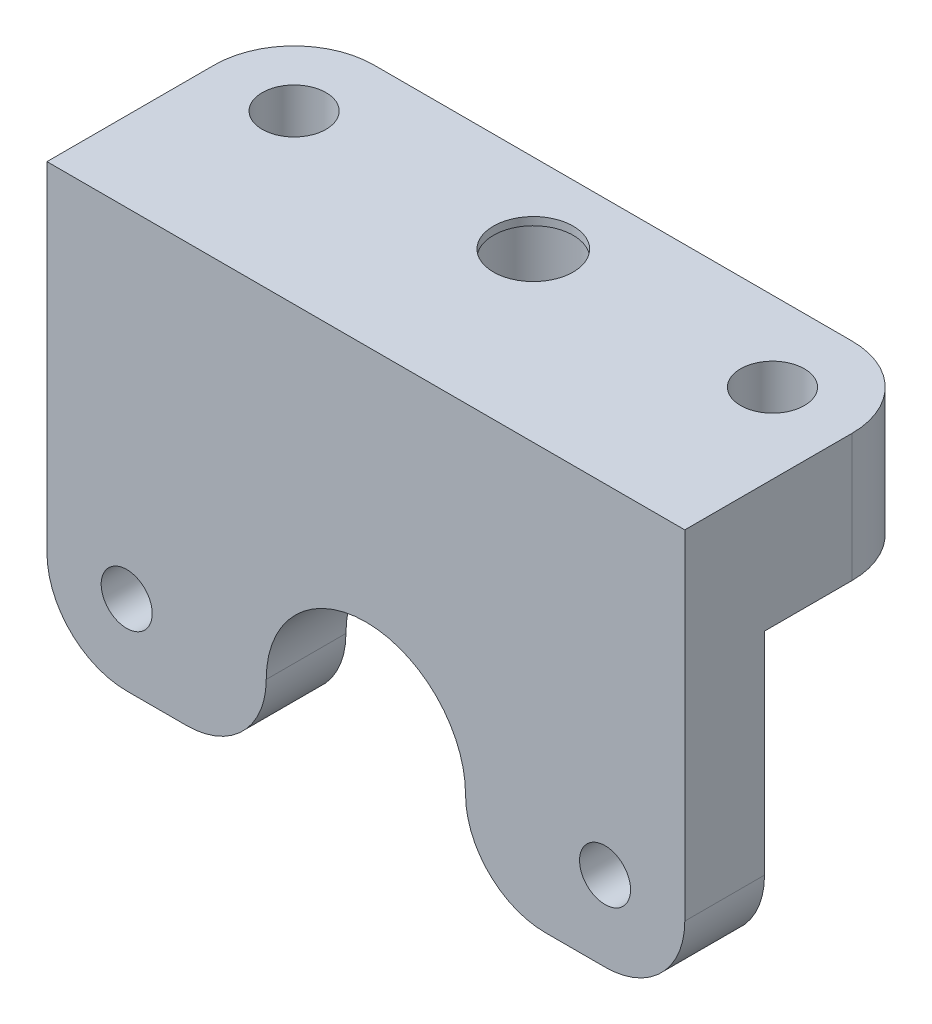
ISO-10303-21;
HEADER;
FILE_DESCRIPTION(('STEP AP214'),'2;1');
FILE_NAME('part.step','',(''),(''),'','','');
FILE_SCHEMA(('AUTOMOTIVE_DESIGN { 1 0 10303 214 1 1 1 1 }'));
ENDSEC;
DATA;
#1=APPLICATION_CONTEXT('core data for automotive mechanical design processes');
#2=APPLICATION_PROTOCOL_DEFINITION('international standard','automotive_design',2000,#1);
#3=PRODUCT_CONTEXT('',#1,'mechanical');
#4=PRODUCT('Part','Part','',(#3));
#5=PRODUCT_RELATED_PRODUCT_CATEGORY('part','',(#4));
#6=PRODUCT_DEFINITION_FORMATION('','',#4);
#7=PRODUCT_DEFINITION_CONTEXT('part definition',#1,'design');
#8=PRODUCT_DEFINITION('design','',#6,#7);
#9=PRODUCT_DEFINITION_SHAPE('','',#8);
#10=(LENGTH_UNIT() NAMED_UNIT(*) SI_UNIT(.MILLI.,.METRE.));
#11=(NAMED_UNIT(*) PLANE_ANGLE_UNIT() SI_UNIT($,.RADIAN.));
#12=(NAMED_UNIT(*) SI_UNIT($,.STERADIAN.) SOLID_ANGLE_UNIT());
#13=UNCERTAINTY_MEASURE_WITH_UNIT(LENGTH_MEASURE(1.E-05),#10,'distance_accuracy_value','');
#14=(GEOMETRIC_REPRESENTATION_CONTEXT(3) GLOBAL_UNCERTAINTY_ASSIGNED_CONTEXT((#13)) GLOBAL_UNIT_ASSIGNED_CONTEXT((#10,
#11,#12)) REPRESENTATION_CONTEXT('',''));
#15=CARTESIAN_POINT('',(0.,0.,0.));
#16=DIRECTION('',(0.,0.,1.));
#17=DIRECTION('',(1.,0.,0.));
#18=AXIS2_PLACEMENT_3D('',#15,#16,#17);
#19=CARTESIAN_POINT('',(15.,6.,0.));
#20=DIRECTION('',(0.,1.,0.));
#21=DIRECTION('',(0.,0.,1.));
#22=AXIS2_PLACEMENT_3D('',#19,#20,#21);
#23=PLANE('',#22);
#24=CARTESIAN_POINT('',(15.,6.,0.));
#25=DIRECTION('',(0.,1.,0.));
#26=DIRECTION('',(0.,0.,1.));
#27=AXIS2_PLACEMENT_3D('',#24,#25,#26);
#28=CIRCLE('',#27,1.2645);
#29=CARTESIAN_POINT('',(15.,6.,1.2645));
#30=VERTEX_POINT('',#29);
#31=EDGE_CURVE('E17',#30,#30,#28,.F.);
#32=ORIENTED_EDGE('',*,*,#31,.T.);
#33=EDGE_LOOP('',(#32));
#34=FACE_BOUND('',#33,.T.);
#35=CARTESIAN_POINT('',(15.,6.,0.));
#36=DIRECTION('',(0.,1.,0.));
#37=DIRECTION('',(0.,0.,1.));
#38=AXIS2_PLACEMENT_3D('',#35,#36,#37);
#39=CIRCLE('',#38,2.);
#40=CARTESIAN_POINT('',(15.,6.,2.));
#41=VERTEX_POINT('',#40);
#42=EDGE_CURVE('E143',#41,#41,#39,.T.);
#43=ORIENTED_EDGE('',*,*,#42,.T.);
#44=EDGE_LOOP('',(#43));
#45=FACE_BOUND('',#44,.T.);
#46=ADVANCED_FACE('F14',(#34,#45),#23,.T.);
#47=CARTESIAN_POINT('',(-15.,6.,0.));
#48=DIRECTION('',(0.,1.,0.));
#49=DIRECTION('',(0.,0.,1.));
#50=AXIS2_PLACEMENT_3D('',#47,#48,#49);
#51=PLANE('',#50);
#52=CARTESIAN_POINT('',(-15.,6.,0.));
#53=DIRECTION('',(0.,1.,0.));
#54=DIRECTION('',(0.,0.,1.));
#55=AXIS2_PLACEMENT_3D('',#52,#53,#54);
#56=CIRCLE('',#55,1.2645);
#57=CARTESIAN_POINT('',(-15.,6.,1.2645));
#58=VERTEX_POINT('',#57);
#59=EDGE_CURVE('E148',#58,#58,#56,.F.);
#60=ORIENTED_EDGE('',*,*,#59,.T.);
#61=EDGE_LOOP('',(#60));
#62=FACE_BOUND('',#61,.T.);
#63=CARTESIAN_POINT('',(-15.,6.,0.));
#64=DIRECTION('',(0.,1.,0.));
#65=DIRECTION('',(0.,0.,1.));
#66=AXIS2_PLACEMENT_3D('',#63,#64,#65);
#67=CIRCLE('',#66,2.);
#68=CARTESIAN_POINT('',(-15.,6.,2.));
#69=VERTEX_POINT('',#68);
#70=EDGE_CURVE('E140',#69,#69,#67,.T.);
#71=ORIENTED_EDGE('',*,*,#70,.T.);
#72=EDGE_LOOP('',(#71));
#73=FACE_BOUND('',#72,.T.);
#74=ADVANCED_FACE('F171',(#62,#73),#51,.T.);
#75=CARTESIAN_POINT('',(0.,9.5,0.));
#76=DIRECTION('',(0.,1.,0.));
#77=DIRECTION('',(0.,0.,1.));
#78=AXIS2_PLACEMENT_3D('',#75,#76,#77);
#79=PLANE('',#78);
#80=CARTESIAN_POINT('',(0.,9.5,0.));
#81=DIRECTION('',(0.,1.,0.));
#82=DIRECTION('',(0.,0.,1.));
#83=AXIS2_PLACEMENT_3D('',#80,#81,#82);
#84=CIRCLE('',#83,2.5);
#85=CARTESIAN_POINT('',(0.,9.5,2.5));
#86=VERTEX_POINT('',#85);
#87=EDGE_CURVE('E124',#86,#86,#84,.T.);
#88=ORIENTED_EDGE('',*,*,#87,.T.);
#89=EDGE_LOOP('',(#88));
#90=FACE_BOUND('',#89,.T.);
#91=CARTESIAN_POINT('',(0.,9.5,0.));
#92=DIRECTION('',(0.,1.,0.));
#93=DIRECTION('',(0.,0.,1.));
#94=AXIS2_PLACEMENT_3D('',#91,#92,#93);
#95=CIRCLE('',#94,3.125);
#96=CARTESIAN_POINT('',(0.,9.5,3.125));
#97=VERTEX_POINT('',#96);
#98=EDGE_CURVE('E146',#97,#97,#95,.F.);
#99=ORIENTED_EDGE('',*,*,#98,.T.);
#100=EDGE_LOOP('',(#99));
#101=FACE_BOUND('',#100,.T.);
#102=ADVANCED_FACE('F160',(#90,#101),#79,.F.);
#103=CARTESIAN_POINT('',(15.,2.,0.));
#104=DIRECTION('',(0.,1.,0.));
#105=DIRECTION('',(0.,0.,1.));
#106=AXIS2_PLACEMENT_3D('',#103,#104,#105);
#107=CYLINDRICAL_SURFACE('',#106,1.2645);
#108=CARTESIAN_POINT('',(15.,2.,0.));
#109=DIRECTION('',(0.,1.,0.));
#110=DIRECTION('',(0.,0.,1.));
#111=AXIS2_PLACEMENT_3D('',#108,#109,#110);
#112=CIRCLE('',#111,1.2645);
#113=CARTESIAN_POINT('',(15.,2.,1.2645));
#114=VERTEX_POINT('',#113);
#115=EDGE_CURVE('E134',#114,#114,#112,.F.);
#116=ORIENTED_EDGE('',*,*,#115,.T.);
#117=EDGE_LOOP('',(#116));
#118=FACE_BOUND('',#117,.T.);
#119=ORIENTED_EDGE('',*,*,#31,.F.);
#120=EDGE_LOOP('',(#119));
#121=FACE_BOUND('',#120,.T.);
#122=ADVANCED_FACE('F157',(#118,#121),#107,.F.);
#123=CARTESIAN_POINT('',(-15.,2.,0.));
#124=DIRECTION('',(0.,1.,0.));
#125=DIRECTION('',(0.,0.,1.));
#126=AXIS2_PLACEMENT_3D('',#123,#124,#125);
#127=CYLINDRICAL_SURFACE('',#126,1.2645);
#128=CARTESIAN_POINT('',(-15.,2.,0.));
#129=DIRECTION('',(0.,1.,0.));
#130=DIRECTION('',(0.,0.,1.));
#131=AXIS2_PLACEMENT_3D('',#128,#129,#130);
#132=CIRCLE('',#131,1.2645);
#133=CARTESIAN_POINT('',(-15.,2.,1.2645));
#134=VERTEX_POINT('',#133);
#135=EDGE_CURVE('E267',#134,#134,#132,.F.);
#136=ORIENTED_EDGE('',*,*,#135,.T.);
#137=EDGE_LOOP('',(#136));
#138=FACE_BOUND('',#137,.T.);
#139=ORIENTED_EDGE('',*,*,#59,.F.);
#140=EDGE_LOOP('',(#139));
#141=FACE_BOUND('',#140,.T.);
#142=ADVANCED_FACE('F159',(#138,#141),#127,.F.);
#143=CARTESIAN_POINT('',(0.,0.,0.));
#144=DIRECTION('',(0.,1.,0.));
#145=DIRECTION('',(0.,0.,1.));
#146=AXIS2_PLACEMENT_3D('',#143,#144,#145);
#147=CYLINDRICAL_SURFACE('',#146,3.125);
#148=ORIENTED_EDGE('',*,*,#98,.F.);
#149=EDGE_LOOP('',(#148));
#150=FACE_BOUND('',#149,.T.);
#151=CARTESIAN_POINT('',(0.,2.,0.));
#152=DIRECTION('',(0.,1.,0.));
#153=DIRECTION('',(0.,0.,1.));
#154=AXIS2_PLACEMENT_3D('',#151,#152,#153);
#155=CIRCLE('',#154,3.125);
#156=CARTESIAN_POINT('',(0.,2.,3.125));
#157=VERTEX_POINT('',#156);
#158=EDGE_CURVE('E265',#157,#157,#155,.F.);
#159=ORIENTED_EDGE('',*,*,#158,.T.);
#160=EDGE_LOOP('',(#159));
#161=FACE_BOUND('',#160,.T.);
#162=ADVANCED_FACE('F168',(#150,#161),#147,.F.);
#163=CARTESIAN_POINT('',(15.,0.,0.));
#164=DIRECTION('',(0.,1.,0.));
#165=DIRECTION('',(0.,0.,1.));
#166=AXIS2_PLACEMENT_3D('',#163,#164,#165);
#167=CYLINDRICAL_SURFACE('',#166,5.);
#168=CARTESIAN_POINT('',(15.,10.,0.));
#169=DIRECTION('',(0.,1.,0.));
#170=DIRECTION('',(0.,0.,1.));
#171=AXIS2_PLACEMENT_3D('',#168,#169,#170);
#172=CIRCLE('',#171,5.);
#173=CARTESIAN_POINT('',(20.,10.,0.));
#174=VERTEX_POINT('',#173);
#175=CARTESIAN_POINT('',(15.,10.,-5.));
#176=VERTEX_POINT('',#175);
#177=EDGE_CURVE('E278',#174,#176,#172,.T.);
#178=ORIENTED_EDGE('',*,*,#177,.F.);
#179=DIRECTION('',(0.,1.,0.));
#180=VECTOR('',#179,1.);
#181=CARTESIAN_POINT('',(20.,0.,0.));
#182=LINE('',#181,#180);
#183=CARTESIAN_POINT('',(20.,2.,0.));
#184=VERTEX_POINT('',#183);
#185=EDGE_CURVE('E282',#184,#174,#182,.T.);
#186=ORIENTED_EDGE('',*,*,#185,.F.);
#187=CARTESIAN_POINT('',(15.,2.,0.));
#188=DIRECTION('',(0.,1.,0.));
#189=DIRECTION('',(0.,0.,1.));
#190=AXIS2_PLACEMENT_3D('',#187,#188,#189);
#191=CIRCLE('',#190,5.);
#192=CARTESIAN_POINT('',(15.,2.,-5.));
#193=VERTEX_POINT('',#192);
#194=EDGE_CURVE('E132',#184,#193,#191,.T.);
#195=ORIENTED_EDGE('',*,*,#194,.T.);
#196=DIRECTION('',(0.,1.,0.));
#197=VECTOR('',#196,1.);
#198=CARTESIAN_POINT('',(15.,0.,-5.));
#199=LINE('',#198,#197);
#200=EDGE_CURVE('E111',#176,#193,#199,.F.);
#201=ORIENTED_EDGE('',*,*,#200,.F.);
#202=EDGE_LOOP('',(#178,#186,#195,#201));
#203=FACE_BOUND('',#202,.T.);
#204=ADVANCED_FACE('F253',(#203),#167,.T.);
#205=CARTESIAN_POINT('',(15.,0.,-5.));
#206=DIRECTION('',(0.,0.,-1.));
#207=DIRECTION('',(-1.,0.,0.));
#208=AXIS2_PLACEMENT_3D('',#205,#206,#207);
#209=PLANE('',#208);
#210=DIRECTION('',(1.,0.,0.));
#211=VECTOR('',#210,1.);
#212=CARTESIAN_POINT('',(0.,10.,-5.));
#213=LINE('',#212,#211);
#214=CARTESIAN_POINT('',(-15.,10.,-5.));
#215=VERTEX_POINT('',#214);
#216=EDGE_CURVE('E281',#176,#215,#213,.F.);
#217=ORIENTED_EDGE('',*,*,#216,.F.);
#218=ORIENTED_EDGE('',*,*,#200,.T.);
#219=DIRECTION('',(1.,0.,0.));
#220=VECTOR('',#219,1.);
#221=CARTESIAN_POINT('',(0.,2.,-5.));
#222=LINE('',#221,#220);
#223=CARTESIAN_POINT('',(-15.,2.,-5.));
#224=VERTEX_POINT('',#223);
#225=EDGE_CURVE('E105',#193,#224,#222,.F.);
#226=ORIENTED_EDGE('',*,*,#225,.T.);
#227=DIRECTION('',(0.,1.,0.));
#228=VECTOR('',#227,1.);
#229=CARTESIAN_POINT('',(-15.,0.,-5.));
#230=LINE('',#229,#228);
#231=EDGE_CURVE('E109',#215,#224,#230,.F.);
#232=ORIENTED_EDGE('',*,*,#231,.F.);
#233=EDGE_LOOP('',(#217,#218,#226,#232));
#234=FACE_BOUND('',#233,.T.);
#235=ADVANCED_FACE('F108',(#234),#209,.T.);
#236=CARTESIAN_POINT('',(15.,0.,0.));
#237=DIRECTION('',(0.,1.,0.));
#238=DIRECTION('',(0.,0.,1.));
#239=AXIS2_PLACEMENT_3D('',#236,#237,#238);
#240=CYLINDRICAL_SURFACE('',#239,2.);
#241=ORIENTED_EDGE('',*,*,#42,.F.);
#242=EDGE_LOOP('',(#241));
#243=FACE_BOUND('',#242,.T.);
#244=CARTESIAN_POINT('',(15.,10.,0.));
#245=DIRECTION('',(0.,1.,0.));
#246=DIRECTION('',(0.,0.,1.));
#247=AXIS2_PLACEMENT_3D('',#244,#245,#246);
#248=CIRCLE('',#247,2.);
#249=CARTESIAN_POINT('',(15.,10.,2.));
#250=VERTEX_POINT('',#249);
#251=EDGE_CURVE('E285',#250,#250,#248,.F.);
#252=ORIENTED_EDGE('',*,*,#251,.F.);
#253=EDGE_LOOP('',(#252));
#254=FACE_BOUND('',#253,.T.);
#255=ADVANCED_FACE('F246',(#243,#254),#240,.F.);
#256=CARTESIAN_POINT('',(-15.,0.,0.));
#257=DIRECTION('',(0.,1.,0.));
#258=DIRECTION('',(0.,0.,1.));
#259=AXIS2_PLACEMENT_3D('',#256,#257,#258);
#260=CYLINDRICAL_SURFACE('',#259,2.);
#261=ORIENTED_EDGE('',*,*,#70,.F.);
#262=EDGE_LOOP('',(#261));
#263=FACE_BOUND('',#262,.T.);
#264=CARTESIAN_POINT('',(-15.,10.,0.));
#265=DIRECTION('',(0.,1.,0.));
#266=DIRECTION('',(0.,0.,1.));
#267=AXIS2_PLACEMENT_3D('',#264,#265,#266);
#268=CIRCLE('',#267,2.);
#269=CARTESIAN_POINT('',(-15.,10.,2.));
#270=VERTEX_POINT('',#269);
#271=EDGE_CURVE('E288',#270,#270,#268,.F.);
#272=ORIENTED_EDGE('',*,*,#271,.F.);
#273=EDGE_LOOP('',(#272));
#274=FACE_BOUND('',#273,.T.);
#275=ADVANCED_FACE('F242',(#263,#274),#260,.F.);
#276=CARTESIAN_POINT('',(0.,0.,0.));
#277=DIRECTION('',(0.,1.,0.));
#278=DIRECTION('',(0.,0.,1.));
#279=AXIS2_PLACEMENT_3D('',#276,#277,#278);
#280=CYLINDRICAL_SURFACE('',#279,2.5);
#281=ORIENTED_EDGE('',*,*,#87,.F.);
#282=EDGE_LOOP('',(#281));
#283=FACE_BOUND('',#282,.T.);
#284=CARTESIAN_POINT('',(0.,10.,0.));
#285=DIRECTION('',(0.,1.,0.));
#286=DIRECTION('',(0.,0.,1.));
#287=AXIS2_PLACEMENT_3D('',#284,#285,#286);
#288=CIRCLE('',#287,2.5);
#289=CARTESIAN_POINT('',(0.,10.,2.5));
#290=VERTEX_POINT('',#289);
#291=EDGE_CURVE('E291',#290,#290,#288,.F.);
#292=ORIENTED_EDGE('',*,*,#291,.F.);
#293=EDGE_LOOP('',(#292));
#294=FACE_BOUND('',#293,.T.);
#295=ADVANCED_FACE('F239',(#283,#294),#280,.F.);
#296=CARTESIAN_POINT('',(-15.,0.,0.));
#297=DIRECTION('',(0.,1.,0.));
#298=DIRECTION('',(0.,0.,1.));
#299=AXIS2_PLACEMENT_3D('',#296,#297,#298);
#300=CYLINDRICAL_SURFACE('',#299,5.);
#301=CARTESIAN_POINT('',(-15.,10.,0.));
#302=DIRECTION('',(0.,1.,0.));
#303=DIRECTION('',(0.,0.,1.));
#304=AXIS2_PLACEMENT_3D('',#301,#302,#303);
#305=CIRCLE('',#304,5.);
#306=CARTESIAN_POINT('',(-20.,10.,0.));
#307=VERTEX_POINT('',#306);
#308=EDGE_CURVE('E122',#215,#307,#305,.T.);
#309=ORIENTED_EDGE('',*,*,#308,.F.);
#310=ORIENTED_EDGE('',*,*,#231,.T.);
#311=CARTESIAN_POINT('',(-15.,2.,0.));
#312=DIRECTION('',(0.,1.,0.));
#313=DIRECTION('',(0.,0.,1.));
#314=AXIS2_PLACEMENT_3D('',#311,#312,#313);
#315=CIRCLE('',#314,5.);
#316=CARTESIAN_POINT('',(-20.,2.,0.));
#317=VERTEX_POINT('',#316);
#318=EDGE_CURVE('E115',#224,#317,#315,.T.);
#319=ORIENTED_EDGE('',*,*,#318,.T.);
#320=DIRECTION('',(0.,1.,0.));
#321=VECTOR('',#320,1.);
#322=CARTESIAN_POINT('',(-20.,0.,0.));
#323=LINE('',#322,#321);
#324=EDGE_CURVE('E351',#307,#317,#323,.F.);
#325=ORIENTED_EDGE('',*,*,#324,.F.);
#326=EDGE_LOOP('',(#309,#310,#319,#325));
#327=FACE_BOUND('',#326,.T.);
#328=ADVANCED_FACE('F119',(#327),#300,.T.);
#329=CARTESIAN_POINT('',(0.,2.,0.25));
#330=DIRECTION('',(0.,1.,0.));
#331=DIRECTION('',(0.,0.,1.));
#332=AXIS2_PLACEMENT_3D('',#329,#330,#331);
#333=PLANE('',#332);
#334=ORIENTED_EDGE('',*,*,#158,.F.);
#335=EDGE_LOOP('',(#334));
#336=FACE_BOUND('',#335,.T.);
#337=ORIENTED_EDGE('',*,*,#135,.F.);
#338=EDGE_LOOP('',(#337));
#339=FACE_BOUND('',#338,.T.);
#340=ORIENTED_EDGE('',*,*,#115,.F.);
#341=EDGE_LOOP('',(#340));
#342=FACE_BOUND('',#341,.T.);
#343=DIRECTION('',(0.,0.,-1.));
#344=VECTOR('',#343,1.);
#345=CARTESIAN_POINT('',(20.,2.,5.5));
#346=LINE('',#345,#344);
#347=CARTESIAN_POINT('',(20.,2.,5.5));
#348=VERTEX_POINT('',#347);
#349=EDGE_CURVE('E343',#348,#184,#346,.T.);
#350=ORIENTED_EDGE('',*,*,#349,.F.);
#351=DIRECTION('',(1.,0.,0.));
#352=VECTOR('',#351,1.);
#353=CARTESIAN_POINT('',(0.,2.,5.5));
#354=LINE('',#353,#352);
#355=CARTESIAN_POINT('',(-20.,2.,5.5));
#356=VERTEX_POINT('',#355);
#357=EDGE_CURVE('E266',#348,#356,#354,.F.);
#358=ORIENTED_EDGE('',*,*,#357,.T.);
#359=DIRECTION('',(0.,0.,1.));
#360=VECTOR('',#359,1.);
#361=CARTESIAN_POINT('',(-20.,2.,0.));
#362=LINE('',#361,#360);
#363=EDGE_CURVE('E130',#317,#356,#362,.T.);
#364=ORIENTED_EDGE('',*,*,#363,.F.);
#365=ORIENTED_EDGE('',*,*,#318,.F.);
#366=ORIENTED_EDGE('',*,*,#225,.F.);
#367=ORIENTED_EDGE('',*,*,#194,.F.);
#368=EDGE_LOOP('',(#350,#358,#364,#365,#366,#367));
#369=FACE_BOUND('',#368,.T.);
#370=ADVANCED_FACE('F127',(#336,#339,#342,#369),#333,.F.);
#371=CARTESIAN_POINT('',(0.,-3.125,5.5));
#372=DIRECTION('',(0.,0.,1.));
#373=DIRECTION('',(1.,0.,0.));
#374=AXIS2_PLACEMENT_3D('',#371,#372,#373);
#375=PLANE('',#374);
#376=CARTESIAN_POINT('',(15.,-11.25,5.5));
#377=DIRECTION('',(0.,0.,1.));
#378=DIRECTION('',(1.,0.,0.));
#379=AXIS2_PLACEMENT_3D('',#376,#377,#378);
#380=CIRCLE('',#379,1.6);
#381=CARTESIAN_POINT('',(16.6,-11.25,5.5));
#382=VERTEX_POINT('',#381);
#383=EDGE_CURVE('E313',#382,#382,#380,.T.);
#384=ORIENTED_EDGE('',*,*,#383,.T.);
#385=EDGE_LOOP('',(#384));
#386=FACE_BOUND('',#385,.T.);
#387=CARTESIAN_POINT('',(-15.,-11.25,5.5));
#388=DIRECTION('',(0.,0.,1.));
#389=DIRECTION('',(1.,0.,0.));
#390=AXIS2_PLACEMENT_3D('',#387,#388,#389);
#391=CIRCLE('',#390,1.6);
#392=CARTESIAN_POINT('',(-13.4,-11.25,5.5));
#393=VERTEX_POINT('',#392);
#394=EDGE_CURVE('E310',#393,#393,#391,.T.);
#395=ORIENTED_EDGE('',*,*,#394,.T.);
#396=EDGE_LOOP('',(#395));
#397=FACE_BOUND('',#396,.T.);
#398=DIRECTION('',(1.,0.,0.));
#399=VECTOR('',#398,1.);
#400=CARTESIAN_POINT('',(6.25,-16.25,5.5));
#401=LINE('',#400,#399);
#402=CARTESIAN_POINT('',(11.25,-16.25,5.5));
#403=VERTEX_POINT('',#402);
#404=CARTESIAN_POINT('',(15.,-16.25,5.5));
#405=VERTEX_POINT('',#404);
#406=EDGE_CURVE('E314',#403,#405,#401,.T.);
#407=ORIENTED_EDGE('',*,*,#406,.F.);
#408=CARTESIAN_POINT('',(11.25,-11.25,5.5));
#409=DIRECTION('',(0.,0.,1.));
#410=DIRECTION('',(1.,0.,0.));
#411=AXIS2_PLACEMENT_3D('',#408,#409,#410);
#412=CIRCLE('',#411,5.);
#413=CARTESIAN_POINT('',(6.25,-11.25,5.5));
#414=VERTEX_POINT('',#413);
#415=EDGE_CURVE('E307',#414,#403,#412,.T.);
#416=ORIENTED_EDGE('',*,*,#415,.F.);
#417=CARTESIAN_POINT('',(0.,-11.25,5.5));
#418=DIRECTION('',(0.,0.,1.));
#419=DIRECTION('',(1.,0.,0.));
#420=AXIS2_PLACEMENT_3D('',#417,#418,#419);
#421=CIRCLE('',#420,6.25);
#422=CARTESIAN_POINT('',(-6.25,-11.25,5.5));
#423=VERTEX_POINT('',#422);
#424=EDGE_CURVE('E303',#414,#423,#421,.T.);
#425=ORIENTED_EDGE('',*,*,#424,.T.);
#426=CARTESIAN_POINT('',(-11.25,-11.25,5.5));
#427=DIRECTION('',(0.,0.,1.));
#428=DIRECTION('',(1.,0.,0.));
#429=AXIS2_PLACEMENT_3D('',#426,#427,#428);
#430=CIRCLE('',#429,5.);
#431=CARTESIAN_POINT('',(-11.25,-16.25,5.5));
#432=VERTEX_POINT('',#431);
#433=EDGE_CURVE('E299',#432,#423,#430,.T.);
#434=ORIENTED_EDGE('',*,*,#433,.F.);
#435=DIRECTION('',(1.,0.,0.));
#436=VECTOR('',#435,1.);
#437=CARTESIAN_POINT('',(-20.,-16.25,5.5));
#438=LINE('',#437,#436);
#439=CARTESIAN_POINT('',(-15.,-16.25,5.5));
#440=VERTEX_POINT('',#439);
#441=EDGE_CURVE('E362',#440,#432,#438,.T.);
#442=ORIENTED_EDGE('',*,*,#441,.F.);
#443=CARTESIAN_POINT('',(-15.,-11.25,5.5));
#444=DIRECTION('',(0.,0.,1.));
#445=DIRECTION('',(1.,0.,0.));
#446=AXIS2_PLACEMENT_3D('',#443,#444,#445);
#447=CIRCLE('',#446,5.);
#448=CARTESIAN_POINT('',(-20.,-11.25,5.5));
#449=VERTEX_POINT('',#448);
#450=EDGE_CURVE('E295',#449,#440,#447,.T.);
#451=ORIENTED_EDGE('',*,*,#450,.F.);
#452=DIRECTION('',(0.,1.,0.));
#453=VECTOR('',#452,1.);
#454=CARTESIAN_POINT('',(-20.,0.,5.5));
#455=LINE('',#454,#453);
#456=EDGE_CURVE('E356',#356,#449,#455,.F.);
#457=ORIENTED_EDGE('',*,*,#456,.F.);
#458=ORIENTED_EDGE('',*,*,#357,.F.);
#459=DIRECTION('',(0.,1.,0.));
#460=VECTOR('',#459,1.);
#461=CARTESIAN_POINT('',(20.,0.,5.5));
#462=LINE('',#461,#460);
#463=CARTESIAN_POINT('',(20.,-11.25,5.5));
#464=VERTEX_POINT('',#463);
#465=EDGE_CURVE('E340',#464,#348,#462,.T.);
#466=ORIENTED_EDGE('',*,*,#465,.F.);
#467=CARTESIAN_POINT('',(15.,-11.25,5.5));
#468=DIRECTION('',(0.,0.,1.));
#469=DIRECTION('',(1.,0.,0.));
#470=AXIS2_PLACEMENT_3D('',#467,#468,#469);
#471=CIRCLE('',#470,5.);
#472=EDGE_CURVE('E269',#405,#464,#471,.T.);
#473=ORIENTED_EDGE('',*,*,#472,.F.);
#474=EDGE_LOOP('',(#407,#416,#425,#434,#442,#451,#457,#458,#466,#473));
#475=FACE_BOUND('',#474,.T.);
#476=ADVANCED_FACE('F229',(#386,#397,#475),#375,.F.);
#477=CARTESIAN_POINT('',(15.,-11.25,5.5));
#478=DIRECTION('',(0.,0.,1.));
#479=DIRECTION('',(1.,0.,0.));
#480=AXIS2_PLACEMENT_3D('',#477,#478,#479);
#481=CYLINDRICAL_SURFACE('',#480,5.);
#482=ORIENTED_EDGE('',*,*,#472,.T.);
#483=DIRECTION('',(0.,0.,-1.));
#484=VECTOR('',#483,1.);
#485=CARTESIAN_POINT('',(20.,-11.25,5.5));
#486=LINE('',#485,#484);
#487=CARTESIAN_POINT('',(20.,-11.25,10.5));
#488=VERTEX_POINT('',#487);
#489=EDGE_CURVE('E277',#488,#464,#486,.T.);
#490=ORIENTED_EDGE('',*,*,#489,.F.);
#491=CARTESIAN_POINT('',(15.,-11.25,10.5));
#492=DIRECTION('',(0.,0.,1.));
#493=DIRECTION('',(1.,0.,0.));
#494=AXIS2_PLACEMENT_3D('',#491,#492,#493);
#495=CIRCLE('',#494,5.);
#496=CARTESIAN_POINT('',(15.,-16.25,10.5));
#497=VERTEX_POINT('',#496);
#498=EDGE_CURVE('E317',#497,#488,#495,.T.);
#499=ORIENTED_EDGE('',*,*,#498,.F.);
#500=DIRECTION('',(0.,0.,1.));
#501=VECTOR('',#500,1.);
#502=CARTESIAN_POINT('',(15.,-16.25,5.5));
#503=LINE('',#502,#501);
#504=EDGE_CURVE('E309',#405,#497,#503,.T.);
#505=ORIENTED_EDGE('',*,*,#504,.F.);
#506=EDGE_LOOP('',(#482,#490,#499,#505));
#507=FACE_BOUND('',#506,.T.);
#508=ADVANCED_FACE('F225',(#507),#481,.T.);
#509=CARTESIAN_POINT('',(20.,0.,5.5));
#510=DIRECTION('',(1.,0.,0.));
#511=DIRECTION('',(0.,0.,-1.));
#512=AXIS2_PLACEMENT_3D('',#509,#510,#511);
#513=PLANE('',#512);
#514=DIRECTION('',(0.,0.,1.));
#515=VECTOR('',#514,1.);
#516=CARTESIAN_POINT('',(20.,10.,0.25));
#517=LINE('',#516,#515);
#518=CARTESIAN_POINT('',(20.,10.,10.5));
#519=VERTEX_POINT('',#518);
#520=EDGE_CURVE('E284',#519,#174,#517,.F.);
#521=ORIENTED_EDGE('',*,*,#520,.F.);
#522=DIRECTION('',(0.,1.,0.));
#523=VECTOR('',#522,1.);
#524=CARTESIAN_POINT('',(20.,-3.125,10.5));
#525=LINE('',#524,#523);
#526=EDGE_CURVE('E320',#488,#519,#525,.T.);
#527=ORIENTED_EDGE('',*,*,#526,.F.);
#528=ORIENTED_EDGE('',*,*,#489,.T.);
#529=ORIENTED_EDGE('',*,*,#465,.T.);
#530=ORIENTED_EDGE('',*,*,#349,.T.);
#531=ORIENTED_EDGE('',*,*,#185,.T.);
#532=EDGE_LOOP('',(#521,#527,#528,#529,#530,#531));
#533=FACE_BOUND('',#532,.T.);
#534=ADVANCED_FACE('F221',(#533),#513,.T.);
#535=CARTESIAN_POINT('',(0.,10.,0.25));
#536=DIRECTION('',(0.,1.,0.));
#537=DIRECTION('',(0.,0.,1.));
#538=AXIS2_PLACEMENT_3D('',#535,#536,#537);
#539=PLANE('',#538);
#540=ORIENTED_EDGE('',*,*,#291,.T.);
#541=EDGE_LOOP('',(#540));
#542=FACE_BOUND('',#541,.T.);
#543=ORIENTED_EDGE('',*,*,#271,.T.);
#544=EDGE_LOOP('',(#543));
#545=FACE_BOUND('',#544,.T.);
#546=ORIENTED_EDGE('',*,*,#251,.T.);
#547=EDGE_LOOP('',(#546));
#548=FACE_BOUND('',#547,.T.);
#549=DIRECTION('',(1.,0.,0.));
#550=VECTOR('',#549,1.);
#551=CARTESIAN_POINT('',(0.,10.,10.5));
#552=LINE('',#551,#550);
#553=CARTESIAN_POINT('',(-20.,10.,10.5));
#554=VERTEX_POINT('',#553);
#555=EDGE_CURVE('E375',#519,#554,#552,.F.);
#556=ORIENTED_EDGE('',*,*,#555,.F.);
#557=ORIENTED_EDGE('',*,*,#520,.T.);
#558=ORIENTED_EDGE('',*,*,#177,.T.);
#559=ORIENTED_EDGE('',*,*,#216,.T.);
#560=ORIENTED_EDGE('',*,*,#308,.T.);
#561=DIRECTION('',(0.,0.,1.));
#562=VECTOR('',#561,1.);
#563=CARTESIAN_POINT('',(-20.,10.,0.));
#564=LINE('',#563,#562);
#565=EDGE_CURVE('E294',#554,#307,#564,.F.);
#566=ORIENTED_EDGE('',*,*,#565,.F.);
#567=EDGE_LOOP('',(#556,#557,#558,#559,#560,#566));
#568=FACE_BOUND('',#567,.T.);
#569=ADVANCED_FACE('F217',(#542,#545,#548,#568),#539,.T.);
#570=CARTESIAN_POINT('',(-20.,0.,0.));
#571=DIRECTION('',(-1.,0.,0.));
#572=DIRECTION('',(0.,0.,1.));
#573=AXIS2_PLACEMENT_3D('',#570,#571,#572);
#574=PLANE('',#573);
#575=ORIENTED_EDGE('',*,*,#363,.T.);
#576=ORIENTED_EDGE('',*,*,#456,.T.);
#577=DIRECTION('',(0.,0.,1.));
#578=VECTOR('',#577,1.);
#579=CARTESIAN_POINT('',(-20.,-11.25,2.75));
#580=LINE('',#579,#578);
#581=CARTESIAN_POINT('',(-20.,-11.25,10.5));
#582=VERTEX_POINT('',#581);
#583=EDGE_CURVE('E298',#582,#449,#580,.F.);
#584=ORIENTED_EDGE('',*,*,#583,.F.);
#585=DIRECTION('',(0.,1.,0.));
#586=VECTOR('',#585,1.);
#587=CARTESIAN_POINT('',(-20.,-3.125,10.5));
#588=LINE('',#587,#586);
#589=EDGE_CURVE('E325',#554,#582,#588,.F.);
#590=ORIENTED_EDGE('',*,*,#589,.F.);
#591=ORIENTED_EDGE('',*,*,#565,.T.);
#592=ORIENTED_EDGE('',*,*,#324,.T.);
#593=EDGE_LOOP('',(#575,#576,#584,#590,#591,#592));
#594=FACE_BOUND('',#593,.T.);
#595=ADVANCED_FACE('F213',(#594),#574,.T.);
#596=CARTESIAN_POINT('',(-15.,-11.25,2.75));
#597=DIRECTION('',(0.,0.,1.));
#598=DIRECTION('',(1.,0.,0.));
#599=AXIS2_PLACEMENT_3D('',#596,#597,#598);
#600=CYLINDRICAL_SURFACE('',#599,5.);
#601=ORIENTED_EDGE('',*,*,#450,.T.);
#602=DIRECTION('',(0.,0.,1.));
#603=VECTOR('',#602,1.);
#604=CARTESIAN_POINT('',(-15.,-16.25,5.5));
#605=LINE('',#604,#603);
#606=CARTESIAN_POINT('',(-15.,-16.25,10.5));
#607=VERTEX_POINT('',#606);
#608=EDGE_CURVE('E297',#607,#440,#605,.F.);
#609=ORIENTED_EDGE('',*,*,#608,.F.);
#610=CARTESIAN_POINT('',(-15.,-11.25,10.5));
#611=DIRECTION('',(0.,0.,1.));
#612=DIRECTION('',(1.,0.,0.));
#613=AXIS2_PLACEMENT_3D('',#610,#611,#612);
#614=CIRCLE('',#613,5.);
#615=EDGE_CURVE('E321',#582,#607,#614,.T.);
#616=ORIENTED_EDGE('',*,*,#615,.F.);
#617=ORIENTED_EDGE('',*,*,#583,.T.);
#618=EDGE_LOOP('',(#601,#609,#616,#617));
#619=FACE_BOUND('',#618,.T.);
#620=ADVANCED_FACE('F209',(#619),#600,.T.);
#621=CARTESIAN_POINT('',(-20.,-16.25,5.5));
#622=DIRECTION('',(0.,-1.,0.));
#623=DIRECTION('',(1.,0.,0.));
#624=AXIS2_PLACEMENT_3D('',#621,#622,#623);
#625=PLANE('',#624);
#626=ORIENTED_EDGE('',*,*,#608,.T.);
#627=ORIENTED_EDGE('',*,*,#441,.T.);
#628=DIRECTION('',(0.,0.,1.));
#629=VECTOR('',#628,1.);
#630=CARTESIAN_POINT('',(-11.25,-16.25,5.5));
#631=LINE('',#630,#629);
#632=CARTESIAN_POINT('',(-11.25,-16.25,10.5));
#633=VERTEX_POINT('',#632);
#634=EDGE_CURVE('E302',#633,#432,#631,.F.);
#635=ORIENTED_EDGE('',*,*,#634,.F.);
#636=DIRECTION('',(1.,0.,0.));
#637=VECTOR('',#636,1.);
#638=CARTESIAN_POINT('',(0.,-16.25,10.5));
#639=LINE('',#638,#637);
#640=EDGE_CURVE('E324',#607,#633,#639,.T.);
#641=ORIENTED_EDGE('',*,*,#640,.F.);
#642=EDGE_LOOP('',(#626,#627,#635,#641));
#643=FACE_BOUND('',#642,.T.);
#644=ADVANCED_FACE('F205',(#643),#625,.T.);
#645=CARTESIAN_POINT('',(-11.25,-11.25,5.5));
#646=DIRECTION('',(0.,0.,1.));
#647=DIRECTION('',(1.,0.,0.));
#648=AXIS2_PLACEMENT_3D('',#645,#646,#647);
#649=CYLINDRICAL_SURFACE('',#648,5.);
#650=ORIENTED_EDGE('',*,*,#433,.T.);
#651=DIRECTION('',(0.,0.,1.));
#652=VECTOR('',#651,1.);
#653=CARTESIAN_POINT('',(-6.25,-11.25,5.5));
#654=LINE('',#653,#652);
#655=CARTESIAN_POINT('',(-6.25,-11.25,10.5));
#656=VERTEX_POINT('',#655);
#657=EDGE_CURVE('E301',#423,#656,#654,.T.);
#658=ORIENTED_EDGE('',*,*,#657,.T.);
#659=CARTESIAN_POINT('',(-11.25,-11.25,10.5));
#660=DIRECTION('',(0.,0.,1.));
#661=DIRECTION('',(1.,0.,0.));
#662=AXIS2_PLACEMENT_3D('',#659,#660,#661);
#663=CIRCLE('',#662,5.);
#664=EDGE_CURVE('E326',#633,#656,#663,.T.);
#665=ORIENTED_EDGE('',*,*,#664,.F.);
#666=ORIENTED_EDGE('',*,*,#634,.T.);
#667=EDGE_LOOP('',(#650,#658,#665,#666));
#668=FACE_BOUND('',#667,.T.);
#669=ADVANCED_FACE('F201',(#668),#649,.T.);
#670=CARTESIAN_POINT('',(0.,-11.25,5.5));
#671=DIRECTION('',(0.,0.,1.));
#672=DIRECTION('',(1.,0.,0.));
#673=AXIS2_PLACEMENT_3D('',#670,#671,#672);
#674=CYLINDRICAL_SURFACE('',#673,6.25);
#675=DIRECTION('',(0.,0.,1.));
#676=VECTOR('',#675,1.);
#677=CARTESIAN_POINT('',(6.25,-11.25,5.5));
#678=LINE('',#677,#676);
#679=CARTESIAN_POINT('',(6.25,-11.25,10.5));
#680=VERTEX_POINT('',#679);
#681=EDGE_CURVE('E306',#680,#414,#678,.F.);
#682=ORIENTED_EDGE('',*,*,#681,.F.);
#683=CARTESIAN_POINT('',(0.,-11.25,10.5));
#684=DIRECTION('',(0.,0.,1.));
#685=DIRECTION('',(1.,0.,0.));
#686=AXIS2_PLACEMENT_3D('',#683,#684,#685);
#687=CIRCLE('',#686,6.25);
#688=EDGE_CURVE('E329',#656,#680,#687,.F.);
#689=ORIENTED_EDGE('',*,*,#688,.F.);
#690=ORIENTED_EDGE('',*,*,#657,.F.);
#691=ORIENTED_EDGE('',*,*,#424,.F.);
#692=EDGE_LOOP('',(#682,#689,#690,#691));
#693=FACE_BOUND('',#692,.T.);
#694=ADVANCED_FACE('F198',(#693),#674,.F.);
#695=CARTESIAN_POINT('',(11.25,-11.25,5.5));
#696=DIRECTION('',(0.,0.,1.));
#697=DIRECTION('',(1.,0.,0.));
#698=AXIS2_PLACEMENT_3D('',#695,#696,#697);
#699=CYLINDRICAL_SURFACE('',#698,5.);
#700=ORIENTED_EDGE('',*,*,#415,.T.);
#701=DIRECTION('',(0.,0.,1.));
#702=VECTOR('',#701,1.);
#703=CARTESIAN_POINT('',(11.25,-16.25,5.5));
#704=LINE('',#703,#702);
#705=CARTESIAN_POINT('',(11.25,-16.25,10.5));
#706=VERTEX_POINT('',#705);
#707=EDGE_CURVE('E32',#706,#403,#704,.F.);
#708=ORIENTED_EDGE('',*,*,#707,.F.);
#709=CARTESIAN_POINT('',(11.25,-11.25,10.5));
#710=DIRECTION('',(0.,0.,1.));
#711=DIRECTION('',(1.,0.,0.));
#712=AXIS2_PLACEMENT_3D('',#709,#710,#711);
#713=CIRCLE('',#712,5.);
#714=EDGE_CURVE('E332',#680,#706,#713,.T.);
#715=ORIENTED_EDGE('',*,*,#714,.F.);
#716=ORIENTED_EDGE('',*,*,#681,.T.);
#717=EDGE_LOOP('',(#700,#708,#715,#716));
#718=FACE_BOUND('',#717,.T.);
#719=ADVANCED_FACE('F194',(#718),#699,.T.);
#720=CARTESIAN_POINT('',(6.25,-16.25,5.5));
#721=DIRECTION('',(0.,-1.,0.));
#722=DIRECTION('',(1.,0.,0.));
#723=AXIS2_PLACEMENT_3D('',#720,#721,#722);
#724=PLANE('',#723);
#725=ORIENTED_EDGE('',*,*,#707,.T.);
#726=ORIENTED_EDGE('',*,*,#406,.T.);
#727=ORIENTED_EDGE('',*,*,#504,.T.);
#728=DIRECTION('',(1.,0.,0.));
#729=VECTOR('',#728,1.);
#730=CARTESIAN_POINT('',(0.,-16.25,10.5));
#731=LINE('',#730,#729);
#732=EDGE_CURVE('E335',#706,#497,#731,.T.);
#733=ORIENTED_EDGE('',*,*,#732,.F.);
#734=EDGE_LOOP('',(#725,#726,#727,#733));
#735=FACE_BOUND('',#734,.T.);
#736=ADVANCED_FACE('F190',(#735),#724,.T.);
#737=CARTESIAN_POINT('',(-15.,-11.25,5.5));
#738=DIRECTION('',(0.,0.,1.));
#739=DIRECTION('',(1.,0.,0.));
#740=AXIS2_PLACEMENT_3D('',#737,#738,#739);
#741=CYLINDRICAL_SURFACE('',#740,1.6);
#742=ORIENTED_EDGE('',*,*,#394,.F.);
#743=EDGE_LOOP('',(#742));
#744=FACE_BOUND('',#743,.T.);
#745=CARTESIAN_POINT('',(-15.,-11.25,10.5));
#746=DIRECTION('',(0.,0.,1.));
#747=DIRECTION('',(1.,0.,0.));
#748=AXIS2_PLACEMENT_3D('',#745,#746,#747);
#749=CIRCLE('',#748,1.6);
#750=CARTESIAN_POINT('',(-13.4,-11.25,10.5));
#751=VERTEX_POINT('',#750);
#752=EDGE_CURVE('E23',#751,#751,#749,.F.);
#753=ORIENTED_EDGE('',*,*,#752,.F.);
#754=EDGE_LOOP('',(#753));
#755=FACE_BOUND('',#754,.T.);
#756=ADVANCED_FACE('F183',(#744,#755),#741,.F.);
#757=CARTESIAN_POINT('',(15.,-11.25,5.5));
#758=DIRECTION('',(0.,0.,1.));
#759=DIRECTION('',(1.,0.,0.));
#760=AXIS2_PLACEMENT_3D('',#757,#758,#759);
#761=CYLINDRICAL_SURFACE('',#760,1.6);
#762=ORIENTED_EDGE('',*,*,#383,.F.);
#763=EDGE_LOOP('',(#762));
#764=FACE_BOUND('',#763,.T.);
#765=CARTESIAN_POINT('',(15.,-11.25,10.5));
#766=DIRECTION('',(0.,0.,1.));
#767=DIRECTION('',(1.,0.,0.));
#768=AXIS2_PLACEMENT_3D('',#765,#766,#767);
#769=CIRCLE('',#768,1.6);
#770=CARTESIAN_POINT('',(16.6,-11.25,10.5));
#771=VERTEX_POINT('',#770);
#772=EDGE_CURVE('E9',#771,#771,#769,.F.);
#773=ORIENTED_EDGE('',*,*,#772,.F.);
#774=EDGE_LOOP('',(#773));
#775=FACE_BOUND('',#774,.T.);
#776=ADVANCED_FACE('F177',(#764,#775),#761,.F.);
#777=CARTESIAN_POINT('',(0.,-3.125,10.5));
#778=DIRECTION('',(0.,0.,1.));
#779=DIRECTION('',(1.,0.,0.));
#780=AXIS2_PLACEMENT_3D('',#777,#778,#779);
#781=PLANE('',#780);
#782=ORIENTED_EDGE('',*,*,#772,.T.);
#783=EDGE_LOOP('',(#782));
#784=FACE_BOUND('',#783,.T.);
#785=ORIENTED_EDGE('',*,*,#752,.T.);
#786=EDGE_LOOP('',(#785));
#787=FACE_BOUND('',#786,.T.);
#788=ORIENTED_EDGE('',*,*,#714,.T.);
#789=ORIENTED_EDGE('',*,*,#732,.T.);
#790=ORIENTED_EDGE('',*,*,#498,.T.);
#791=ORIENTED_EDGE('',*,*,#526,.T.);
#792=ORIENTED_EDGE('',*,*,#555,.T.);
#793=ORIENTED_EDGE('',*,*,#589,.T.);
#794=ORIENTED_EDGE('',*,*,#615,.T.);
#795=ORIENTED_EDGE('',*,*,#640,.T.);
#796=ORIENTED_EDGE('',*,*,#664,.T.);
#797=ORIENTED_EDGE('',*,*,#688,.T.);
#798=EDGE_LOOP('',(#788,#789,#790,#791,#792,#793,#794,#795,#796,#797));
#799=FACE_BOUND('',#798,.T.);
#800=ADVANCED_FACE('F175',(#784,#787,#799),#781,.T.);
#801=CLOSED_SHELL('',(#46,#74,#102,#122,#142,#162,#204,#235,#255,#275,#295,#328,#370,#476,#508,
#534,#569,#595,#620,#644,#669,#694,#719,#736,#756,#776,#800));
#802=MANIFOLD_SOLID_BREP('B1',#801);
#803=ADVANCED_BREP_SHAPE_REPRESENTATION('',(#18,#802),#14);
#804=SHAPE_DEFINITION_REPRESENTATION(#9,#803);
ENDSEC;
END-ISO-10303-21;
